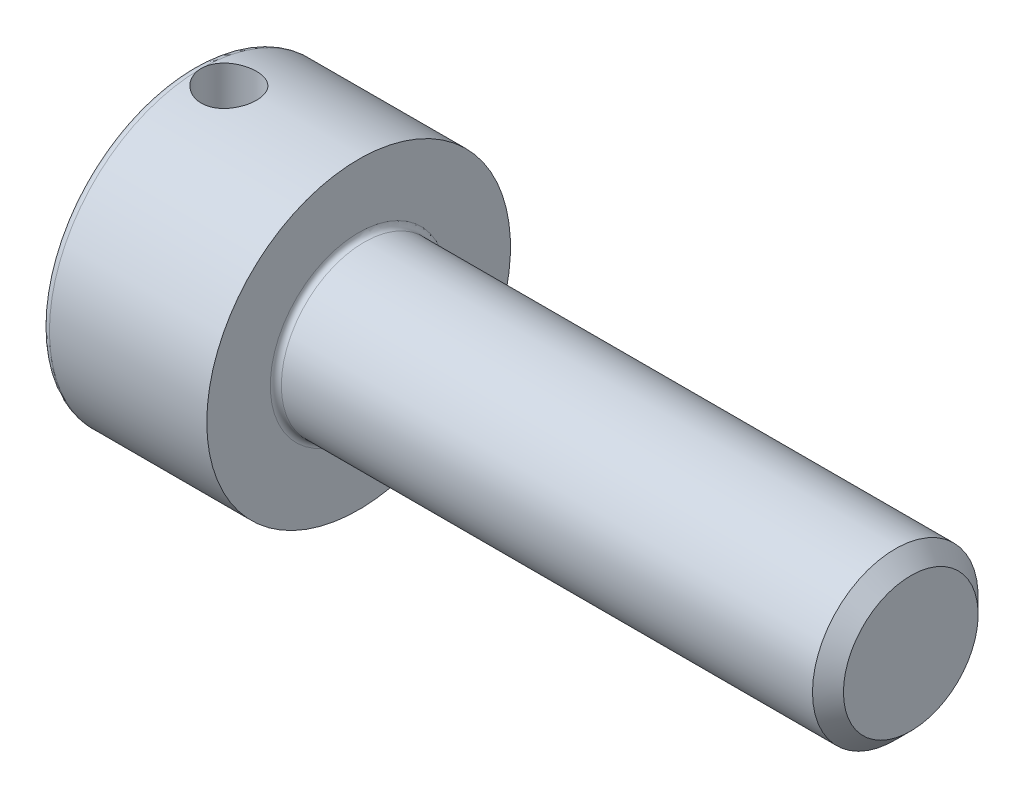
ISO-10303-21;
HEADER;
FILE_DESCRIPTION(('STEP AP214'),'2;1');
FILE_NAME('part.step','',(''),(''),'','','');
FILE_SCHEMA(('AUTOMOTIVE_DESIGN { 1 0 10303 214 1 1 1 1 }'));
ENDSEC;
DATA;
#1=APPLICATION_CONTEXT('core data for automotive mechanical design processes');
#2=APPLICATION_PROTOCOL_DEFINITION('international standard','automotive_design',2000,#1);
#3=PRODUCT_CONTEXT('',#1,'mechanical');
#4=PRODUCT('Part','Part','',(#3));
#5=PRODUCT_RELATED_PRODUCT_CATEGORY('part','',(#4));
#6=PRODUCT_DEFINITION_FORMATION('','',#4);
#7=PRODUCT_DEFINITION_CONTEXT('part definition',#1,'design');
#8=PRODUCT_DEFINITION('design','',#6,#7);
#9=PRODUCT_DEFINITION_SHAPE('','',#8);
#10=(LENGTH_UNIT() NAMED_UNIT(*) SI_UNIT(.MILLI.,.METRE.));
#11=(NAMED_UNIT(*) PLANE_ANGLE_UNIT() SI_UNIT($,.RADIAN.));
#12=(NAMED_UNIT(*) SI_UNIT($,.STERADIAN.) SOLID_ANGLE_UNIT());
#13=UNCERTAINTY_MEASURE_WITH_UNIT(LENGTH_MEASURE(1.E-05),#10,'distance_accuracy_value','');
#14=(GEOMETRIC_REPRESENTATION_CONTEXT(3) GLOBAL_UNCERTAINTY_ASSIGNED_CONTEXT((#13)) GLOBAL_UNIT_ASSIGNED_CONTEXT((#10,
#11,#12)) REPRESENTATION_CONTEXT('',''));
#15=CARTESIAN_POINT('',(0.,0.,0.));
#16=DIRECTION('',(0.,0.,1.));
#17=DIRECTION('',(1.,0.,0.));
#18=AXIS2_PLACEMENT_3D('',#15,#16,#17);
#19=CARTESIAN_POINT('',(0.,0.,0.));
#20=DIRECTION('',(-1.,0.,0.));
#21=DIRECTION('',(0.,0.,1.));
#22=AXIS2_PLACEMENT_3D('',#19,#20,#21);
#23=PLANE('',#22);
#24=DIRECTION('',(0.,-0.499999999999999,0.866025403784439));
#25=VECTOR('',#24,1.);
#26=CARTESIAN_POINT('',(0.,1.47801668912544,0.));
#27=LINE('',#26,#25);
#28=CARTESIAN_POINT('',(0.,1.47801668912544,0.));
#29=VERTEX_POINT('',#28);
#30=CARTESIAN_POINT('',(0.,0.73900834456272,1.28));
#31=VERTEX_POINT('',#30);
#32=EDGE_CURVE('E132',#29,#31,#27,.T.);
#33=ORIENTED_EDGE('',*,*,#32,.T.);
#34=DIRECTION('',(0.,1.,0.));
#35=VECTOR('',#34,1.);
#36=CARTESIAN_POINT('',(0.,-0.739008344562723,1.28));
#37=LINE('',#36,#35);
#38=CARTESIAN_POINT('',(0.,-0.739008344562723,1.28));
#39=VERTEX_POINT('',#38);
#40=EDGE_CURVE('E288',#39,#31,#37,.T.);
#41=ORIENTED_EDGE('',*,*,#40,.F.);
#42=DIRECTION('',(0.,-0.500000000000001,-0.866025403784438));
#43=VECTOR('',#42,1.);
#44=CARTESIAN_POINT('',(0.,-0.739008344562723,1.28));
#45=LINE('',#44,#43);
#46=CARTESIAN_POINT('',(0.,-1.47801668912545,0.));
#47=VERTEX_POINT('',#46);
#48=EDGE_CURVE('E285',#39,#47,#45,.T.);
#49=ORIENTED_EDGE('',*,*,#48,.T.);
#50=DIRECTION('',(0.,0.499999999999999,-0.866025403784439));
#51=VECTOR('',#50,1.);
#52=CARTESIAN_POINT('',(0.,-1.47801668912545,0.));
#53=LINE('',#52,#51);
#54=CARTESIAN_POINT('',(0.,-0.739008344562727,-1.28));
#55=VERTEX_POINT('',#54);
#56=EDGE_CURVE('E282',#47,#55,#53,.T.);
#57=ORIENTED_EDGE('',*,*,#56,.T.);
#58=DIRECTION('',(0.,-1.,0.));
#59=VECTOR('',#58,1.);
#60=CARTESIAN_POINT('',(0.,0.739008344562717,-1.28));
#61=LINE('',#60,#59);
#62=CARTESIAN_POINT('',(0.,0.739008344562717,-1.28));
#63=VERTEX_POINT('',#62);
#64=EDGE_CURVE('E280',#63,#55,#61,.T.);
#65=ORIENTED_EDGE('',*,*,#64,.F.);
#66=DIRECTION('',(0.,-0.500000000000001,-0.866025403784438));
#67=VECTOR('',#66,1.);
#68=CARTESIAN_POINT('',(0.,1.47801668912544,0.));
#69=LINE('',#68,#67);
#70=EDGE_CURVE('E276',#29,#63,#69,.T.);
#71=ORIENTED_EDGE('',*,*,#70,.F.);
#72=EDGE_LOOP('',(#33,#41,#49,#57,#65,#71));
#73=FACE_BOUND('',#72,.T.);
#74=CARTESIAN_POINT('',(0.,0.,0.));
#75=DIRECTION('',(-1.,0.,0.));
#76=DIRECTION('',(0.,0.,1.));
#77=AXIS2_PLACEMENT_3D('',#74,#75,#76);
#78=CIRCLE('',#77,2.6);
#79=CARTESIAN_POINT('',(0.,0.,2.6));
#80=VERTEX_POINT('',#79);
#81=EDGE_CURVE('E230',#80,#80,#78,.T.);
#82=ORIENTED_EDGE('',*,*,#81,.T.);
#83=EDGE_LOOP('',(#82));
#84=FACE_BOUND('',#83,.T.);
#85=ADVANCED_FACE('F35',(#73,#84),#23,.T.);
#86=CARTESIAN_POINT('',(-31.75,0.,0.));
#87=DIRECTION('',(-1.,0.,0.));
#88=DIRECTION('',(0.,0.,1.));
#89=AXIS2_PLACEMENT_3D('',#86,#87,#88);
#90=CYLINDRICAL_SURFACE('',#89,2.75);
#91=CARTESIAN_POINT('',(0.149999999999997,-2.75,0.));
#92=CARTESIAN_POINT('',(0.150001079665167,-2.74999950181964,-0.0278393179110932));
#93=CARTESIAN_POINT('',(0.15233293937066,-2.74957288183359,-0.0556928624795506));
#94=CARTESIAN_POINT('',(0.161593366506228,-2.74791211875499,-0.110616101712077));
#95=CARTESIAN_POINT('',(0.16852591214534,-2.74667727680635,-0.137685096816518));
#96=CARTESIAN_POINT('',(0.186769282417744,-2.74353830808766,-0.190236893128437));
#97=CARTESIAN_POINT('',(0.198076258047438,-2.7416347698298,-0.215721065982544));
#98=CARTESIAN_POINT('',(0.224736832797944,-2.73736667874575,-0.264428000846125));
#99=CARTESIAN_POINT('',(0.240090066297046,-2.7350021675783,-0.287650966919761));
#100=CARTESIAN_POINT('',(0.274591477410674,-2.73004358374958,-0.331441110128096));
#101=CARTESIAN_POINT('',(0.293776460495188,-2.7274474314927,-0.351979056508364));
#102=CARTESIAN_POINT('',(0.335317588522454,-2.72233373802952,-0.389563393352697));
#103=CARTESIAN_POINT('',(0.357673952922284,-2.71981620227815,-0.406609541987443));
#104=CARTESIAN_POINT('',(0.405128182364941,-2.71512460052441,-0.436846737541192));
#105=CARTESIAN_POINT('',(0.430245133807591,-2.71295321777524,-0.45000828316389));
#106=CARTESIAN_POINT('',(0.482379662580989,-2.70922895819225,-0.471913867374946));
#107=CARTESIAN_POINT('',(0.509397086006257,-2.70767603134186,-0.480658263208187));
#108=CARTESIAN_POINT('',(0.564253662339147,-2.70538538379177,-0.493387994278287));
#109=CARTESIAN_POINT('',(0.592080647927403,-2.70463896155586,-0.497424166063612));
#110=CARTESIAN_POINT('',(0.648026101828639,-2.70401957858077,-0.500780621841721));
#111=CARTESIAN_POINT('',(0.676144545379005,-2.70414654423513,-0.500101303241607));
#112=CARTESIAN_POINT('',(0.731507978533252,-2.70525166262295,-0.4940873360675));
#113=CARTESIAN_POINT('',(0.758759466973928,-2.70621928203566,-0.48881029424768));
#114=CARTESIAN_POINT('',(0.811983754591789,-2.70888015318477,-0.473841308350066));
#115=CARTESIAN_POINT('',(0.837956502337945,-2.71057343408079,-0.464149186857971));
#116=CARTESIAN_POINT('',(0.888055697694681,-2.71450595388179,-0.440568244473239));
#117=CARTESIAN_POINT('',(0.912170860666529,-2.71674822928588,-0.426655975928849));
#118=CARTESIAN_POINT('',(0.957746184236321,-2.72152405502929,-0.395046258435107));
#119=CARTESIAN_POINT('',(0.979206090661557,-2.72405763320867,-0.377348447558961));
#120=CARTESIAN_POINT('',(1.01919474911109,-2.72917660202136,-0.338358498545881));
#121=CARTESIAN_POINT('',(1.03767542210923,-2.73176220454117,-0.317017043164224));
#122=CARTESIAN_POINT('',(1.0708012833702,-2.73665937609272,-0.271511135173328));
#123=CARTESIAN_POINT('',(1.08544643740531,-2.7389709426789,-0.247346657374539));
#124=CARTESIAN_POINT('',(1.11049184744625,-2.74306384456335,-0.196831899624324));
#125=CARTESIAN_POINT('',(1.12088731717399,-2.74484458139806,-0.170479195098873));
#126=CARTESIAN_POINT('',(1.13709079812342,-2.74767051367721,-0.116362103615667));
#127=CARTESIAN_POINT('',(1.14289926714348,-2.74871578252274,-0.0885978578290162));
#128=CARTESIAN_POINT('',(1.14969744047978,-2.74994298344665,-0.0328596623946248));
#129=CARTESIAN_POINT('',(1.15075305586352,-2.75013672335286,-0.00489400302723347));
#130=CARTESIAN_POINT('',(1.14819205045462,-2.74967157561875,0.0508143097427419));
#131=CARTESIAN_POINT('',(1.14457564498206,-2.74901272727178,0.0785569733632705));
#132=CARTESIAN_POINT('',(1.13282806260953,-2.74692377158113,0.132824274398189));
#133=CARTESIAN_POINT('',(1.12473003270429,-2.7454993289304,0.159356324364579));
#134=CARTESIAN_POINT('',(1.10428479286951,-2.74203823780556,0.210686178439153));
#135=CARTESIAN_POINT('',(1.09193730807557,-2.74000154973109,0.235483870240237));
#136=CARTESIAN_POINT('',(1.06319634054927,-2.7355124489621,0.282923811768734));
#137=CARTESIAN_POINT('',(1.04676232821102,-2.7330559540365,0.30554111302122));
#138=CARTESIAN_POINT('',(1.01036990583222,-2.72801072017771,0.347720534555868));
#139=CARTESIAN_POINT('',(0.990411187647012,-2.72542196969626,0.36728238743583));
#140=CARTESIAN_POINT('',(0.947238279637873,-2.72036509889411,0.403044344719199));
#141=CARTESIAN_POINT('',(0.923986673368531,-2.71789888030471,0.419199591853546));
#142=CARTESIAN_POINT('',(0.875060954648376,-2.71340377520255,0.447374966380034));
#143=CARTESIAN_POINT('',(0.849386928828901,-2.71137487305885,0.459395241576988));
#144=CARTESIAN_POINT('',(0.796462312577061,-2.70799886153869,0.478894863104366));
#145=CARTESIAN_POINT('',(0.769219692315484,-2.70664859504187,0.4863952696546));
#146=CARTESIAN_POINT('',(0.71383425284223,-2.70477531636347,0.496707600446384));
#147=CARTESIAN_POINT('',(0.685691528787767,-2.7042522170284,0.499520018634073));
#148=CARTESIAN_POINT('',(0.629753656134088,-2.70409673470654,0.50036078415796));
#149=CARTESIAN_POINT('',(0.601959582140362,-2.70445118636029,0.498459842503081));
#150=CARTESIAN_POINT('',(0.547094090495644,-2.70598177186757,0.490082117282036));
#151=CARTESIAN_POINT('',(0.520022669126426,-2.70715790149252,0.483605357264294));
#152=CARTESIAN_POINT('',(0.467405950651155,-2.71019393020228,0.466288917896191));
#153=CARTESIAN_POINT('',(0.441858209944139,-2.71205269824937,0.455456452548081));
#154=CARTESIAN_POINT('',(0.392931388208813,-2.71624544378711,0.429743684162057));
#155=CARTESIAN_POINT('',(0.369552447788601,-2.71857945205735,0.414863118922517));
#156=CARTESIAN_POINT('',(0.325271781351091,-2.72350081162866,0.381228859156997));
#157=CARTESIAN_POINT('',(0.304409607532306,-2.72609126957776,0.362423538882748));
#158=CARTESIAN_POINT('',(0.266113229746949,-2.73120998017163,0.32158162855841));
#159=CARTESIAN_POINT('',(0.248679814901936,-2.73373821837979,0.299544296700233));
#160=CARTESIAN_POINT('',(0.217599925719125,-2.73847243574298,0.252642797411575));
#161=CARTESIAN_POINT('',(0.203986453704965,-2.74067553293358,0.227756462447624));
#162=CARTESIAN_POINT('',(0.181155195981484,-2.74448315248337,0.176018476271586));
#163=CARTESIAN_POINT('',(0.171933210180418,-2.74608824646183,0.149168731371668));
#164=CARTESIAN_POINT('',(0.160056142424449,-2.74818517594122,0.101860437364601));
#165=CARTESIAN_POINT('',(0.156291416759909,-2.74886195068396,0.0816813568191222));
#166=CARTESIAN_POINT('',(0.151262976551272,-2.74976954108261,0.0410040855330506));
#167=CARTESIAN_POINT('',(0.149999204739555,-2.75000036695,0.0205059021102082));
#168=CARTESIAN_POINT('',(0.149999999999997,-2.75,0.));
#169=B_SPLINE_CURVE_WITH_KNOTS('',3,(#91,#92,#93,#94,#95,#96,#97,#98,#99,#100,#101,#102,#103,
#104,#105,#106,#107,#108,#109,#110,#111,#112,#113,#114,#115,#116,#117,#118,#119,#120,#121,#122,
#123,#124,#125,#126,#127,#128,#129,#130,#131,#132,#133,#134,#135,#136,#137,#138,#139,#140,#141,
#142,#143,#144,#145,#146,#147,#148,#149,#150,#151,#152,#153,#154,#155,#156,#157,#158,#159,#160,
#161,#162,#163,#164,#165,#166,#167,#168),.UNSPECIFIED.,.T.,.F.,(4,2,2,2,2,2,2,2,2,2,2,2,2,2,2,2,
2,2,2,2,2,2,2,2,2,2,2,2,2,2,2,2,2,2,2,2,2,2,4),(0.,0.083442972888083,0.166958193018147,
0.250400095716686,0.333834461150375,0.418112536492213,0.502396446657696,0.587304880509126,
0.672206446139326,0.756182552931613,0.840151582560506,0.923083418227238,1.00601858669718,
1.08942326615406,1.17283592330314,1.25748302610468,1.34213088426162,1.42687381755953,
1.51160829215363,1.59516400249341,1.67871586212699,1.76165785821357,1.84460522018555,
1.92841056698916,2.01222324404031,2.09707876532615,2.18193125313119,2.26638525269039,
2.350830353259,2.43401627432593,2.51720176729828,2.6002500506474,2.68330371444226,
2.7675277863251,2.85177121957366,2.93672151135732,3.02159039124541,3.0830542755739,
3.14451675246691),.UNSPECIFIED.);
#170=CARTESIAN_POINT('',(0.149999999999997,-2.75,0.));
#171=VERTEX_POINT('',#170);
#172=EDGE_CURVE('E125',#171,#171,#169,.T.);
#173=ORIENTED_EDGE('',*,*,#172,.F.);
#174=CARTESIAN_POINT('',(0.149999999999997,0.,0.));
#175=DIRECTION('',(-1.,0.,0.));
#176=DIRECTION('',(0.,0.,1.));
#177=AXIS2_PLACEMENT_3D('',#174,#175,#176);
#178=CIRCLE('',#177,2.75);
#179=CARTESIAN_POINT('',(0.149999999999997,2.75,0.));
#180=VERTEX_POINT('',#179);
#181=EDGE_CURVE('E43',#171,#180,#178,.F.);
#182=ORIENTED_EDGE('',*,*,#181,.T.);
#183=CARTESIAN_POINT('',(0.149999999999997,2.75,0.));
#184=CARTESIAN_POINT('',(0.150001079665167,2.74999950181964,0.0278393179110932));
#185=CARTESIAN_POINT('',(0.15233293937066,2.74957288183359,0.0556928624795506));
#186=CARTESIAN_POINT('',(0.161593366506228,2.74791211875499,0.110616101712077));
#187=CARTESIAN_POINT('',(0.16852591214534,2.74667727680635,0.137685096816518));
#188=CARTESIAN_POINT('',(0.186769282417744,2.74353830808766,0.190236893128437));
#189=CARTESIAN_POINT('',(0.198076258047438,2.7416347698298,0.215721065982544));
#190=CARTESIAN_POINT('',(0.224736832797944,2.73736667874575,0.264428000846125));
#191=CARTESIAN_POINT('',(0.240090066297046,2.7350021675783,0.287650966919761));
#192=CARTESIAN_POINT('',(0.274591477410674,2.73004358374958,0.331441110128096));
#193=CARTESIAN_POINT('',(0.293776460495188,2.7274474314927,0.351979056508364));
#194=CARTESIAN_POINT('',(0.335317588522454,2.72233373802952,0.389563393352697));
#195=CARTESIAN_POINT('',(0.357673952922284,2.71981620227815,0.406609541987443));
#196=CARTESIAN_POINT('',(0.405128182364941,2.71512460052441,0.436846737541192));
#197=CARTESIAN_POINT('',(0.430245133807591,2.71295321777524,0.45000828316389));
#198=CARTESIAN_POINT('',(0.482379662580989,2.70922895819225,0.471913867374946));
#199=CARTESIAN_POINT('',(0.509397086006257,2.70767603134186,0.480658263208187));
#200=CARTESIAN_POINT('',(0.564253662339147,2.70538538379177,0.493387994278287));
#201=CARTESIAN_POINT('',(0.592080647927403,2.70463896155586,0.497424166063612));
#202=CARTESIAN_POINT('',(0.648026101828639,2.70401957858077,0.500780621841721));
#203=CARTESIAN_POINT('',(0.676144545379005,2.70414654423513,0.500101303241607));
#204=CARTESIAN_POINT('',(0.731507978533252,2.70525166262295,0.4940873360675));
#205=CARTESIAN_POINT('',(0.758759466973928,2.70621928203566,0.48881029424768));
#206=CARTESIAN_POINT('',(0.811983754591789,2.70888015318477,0.473841308350066));
#207=CARTESIAN_POINT('',(0.837956502337945,2.71057343408079,0.464149186857971));
#208=CARTESIAN_POINT('',(0.888055697694681,2.71450595388179,0.440568244473239));
#209=CARTESIAN_POINT('',(0.912170860666529,2.71674822928588,0.426655975928849));
#210=CARTESIAN_POINT('',(0.957746184236321,2.72152405502929,0.395046258435107));
#211=CARTESIAN_POINT('',(0.979206090661557,2.72405763320867,0.377348447558961));
#212=CARTESIAN_POINT('',(1.01919474911109,2.72917660202136,0.338358498545881));
#213=CARTESIAN_POINT('',(1.03767542210923,2.73176220454117,0.317017043164224));
#214=CARTESIAN_POINT('',(1.0708012833702,2.73665937609272,0.271511135173328));
#215=CARTESIAN_POINT('',(1.08544643740531,2.7389709426789,0.247346657374539));
#216=CARTESIAN_POINT('',(1.11049184744625,2.74306384456335,0.196831899624324));
#217=CARTESIAN_POINT('',(1.12088731717399,2.74484458139806,0.170479195098873));
#218=CARTESIAN_POINT('',(1.13709079812342,2.74767051367721,0.116362103615667));
#219=CARTESIAN_POINT('',(1.14289926714348,2.74871578252274,0.0885978578290162));
#220=CARTESIAN_POINT('',(1.14969744047978,2.74994298344665,0.0328596623946248));
#221=CARTESIAN_POINT('',(1.15075305586352,2.75013672335286,0.00489400302723347));
#222=CARTESIAN_POINT('',(1.14819205045462,2.74967157561875,-0.0508143097427419));
#223=CARTESIAN_POINT('',(1.14457564498206,2.74901272727178,-0.0785569733632705));
#224=CARTESIAN_POINT('',(1.13282806260953,2.74692377158113,-0.132824274398189));
#225=CARTESIAN_POINT('',(1.12473003270429,2.7454993289304,-0.159356324364579));
#226=CARTESIAN_POINT('',(1.10428479286951,2.74203823780556,-0.210686178439153));
#227=CARTESIAN_POINT('',(1.09193730807557,2.74000154973109,-0.235483870240237));
#228=CARTESIAN_POINT('',(1.06319634054927,2.7355124489621,-0.282923811768734));
#229=CARTESIAN_POINT('',(1.04676232821102,2.7330559540365,-0.30554111302122));
#230=CARTESIAN_POINT('',(1.01036990583222,2.72801072017771,-0.347720534555868));
#231=CARTESIAN_POINT('',(0.990411187647012,2.72542196969626,-0.36728238743583));
#232=CARTESIAN_POINT('',(0.947238279637873,2.72036509889411,-0.403044344719199));
#233=CARTESIAN_POINT('',(0.923986673368531,2.71789888030471,-0.419199591853546));
#234=CARTESIAN_POINT('',(0.875060954648376,2.71340377520255,-0.447374966380034));
#235=CARTESIAN_POINT('',(0.849386928828901,2.71137487305885,-0.459395241576988));
#236=CARTESIAN_POINT('',(0.796462312577061,2.70799886153869,-0.478894863104366));
#237=CARTESIAN_POINT('',(0.769219692315484,2.70664859504187,-0.4863952696546));
#238=CARTESIAN_POINT('',(0.71383425284223,2.70477531636347,-0.496707600446384));
#239=CARTESIAN_POINT('',(0.685691528787767,2.7042522170284,-0.499520018634073));
#240=CARTESIAN_POINT('',(0.629753656134088,2.70409673470654,-0.50036078415796));
#241=CARTESIAN_POINT('',(0.601959582140362,2.70445118636029,-0.498459842503081));
#242=CARTESIAN_POINT('',(0.547094090495644,2.70598177186757,-0.490082117282036));
#243=CARTESIAN_POINT('',(0.520022669126426,2.70715790149252,-0.483605357264294));
#244=CARTESIAN_POINT('',(0.467405950651155,2.71019393020228,-0.466288917896191));
#245=CARTESIAN_POINT('',(0.441858209944139,2.71205269824937,-0.455456452548081));
#246=CARTESIAN_POINT('',(0.392931388208813,2.71624544378711,-0.429743684162057));
#247=CARTESIAN_POINT('',(0.369552447788601,2.71857945205735,-0.414863118922517));
#248=CARTESIAN_POINT('',(0.325271781351091,2.72350081162866,-0.381228859156997));
#249=CARTESIAN_POINT('',(0.304409607532306,2.72609126957776,-0.362423538882748));
#250=CARTESIAN_POINT('',(0.266113229746949,2.73120998017163,-0.32158162855841));
#251=CARTESIAN_POINT('',(0.248679814901936,2.73373821837979,-0.299544296700233));
#252=CARTESIAN_POINT('',(0.217599925719125,2.73847243574298,-0.252642797411575));
#253=CARTESIAN_POINT('',(0.203986453704965,2.74067553293358,-0.227756462447624));
#254=CARTESIAN_POINT('',(0.181155195981484,2.74448315248337,-0.176018476271586));
#255=CARTESIAN_POINT('',(0.171933210180418,2.74608824646183,-0.149168731371668));
#256=CARTESIAN_POINT('',(0.160056142424449,2.74818517594122,-0.101860437364601));
#257=CARTESIAN_POINT('',(0.156291416759909,2.74886195068396,-0.0816813568191222));
#258=CARTESIAN_POINT('',(0.151262976551272,2.74976954108261,-0.0410040855330506));
#259=CARTESIAN_POINT('',(0.149999204739555,2.75000036695,-0.0205059021102082));
#260=CARTESIAN_POINT('',(0.149999999999997,2.75,0.));
#261=B_SPLINE_CURVE_WITH_KNOTS('',3,(#183,#184,#185,#186,#187,#188,#189,#190,#191,#192,#193,
#194,#195,#196,#197,#198,#199,#200,#201,#202,#203,#204,#205,#206,#207,#208,#209,#210,#211,#212,
#213,#214,#215,#216,#217,#218,#219,#220,#221,#222,#223,#224,#225,#226,#227,#228,#229,#230,#231,
#232,#233,#234,#235,#236,#237,#238,#239,#240,#241,#242,#243,#244,#245,#246,#247,#248,#249,#250,
#251,#252,#253,#254,#255,#256,#257,#258,#259,#260),.UNSPECIFIED.,.T.,.F.,(4,2,2,2,2,2,2,2,2,2,2,
2,2,2,2,2,2,2,2,2,2,2,2,2,2,2,2,2,2,2,2,2,2,2,2,2,2,2,4),(0.,0.083442972888083,
0.166958193018147,0.250400095716686,0.333834461150375,0.418112536492213,0.502396446657696,
0.587304880509126,0.672206446139326,0.756182552931613,0.840151582560506,0.923083418227238,
1.00601858669718,1.08942326615406,1.17283592330314,1.25748302610468,1.34213088426162,
1.42687381755953,1.51160829215363,1.59516400249341,1.67871586212699,1.76165785821357,
1.84460522018555,1.92841056698916,2.01222324404031,2.09707876532615,2.18193125313119,
2.26638525269039,2.350830353259,2.43401627432593,2.51720176729828,2.6002500506474,
2.68330371444226,2.7675277863251,2.85177121957366,2.93672151135732,3.02159039124541,
3.0830542755739,3.14451675246691),.UNSPECIFIED.);
#262=EDGE_CURVE('E130',#180,#180,#261,.T.);
#263=ORIENTED_EDGE('',*,*,#262,.F.);
#264=EDGE_CURVE('E238',#180,#171,#178,.F.);
#265=ORIENTED_EDGE('',*,*,#264,.T.);
#266=EDGE_LOOP('',(#173,#182,#263,#265));
#267=FACE_BOUND('',#266,.T.);
#268=CARTESIAN_POINT('',(3.,0.,0.));
#269=DIRECTION('',(-1.,0.,0.));
#270=DIRECTION('',(0.,0.,1.));
#271=AXIS2_PLACEMENT_3D('',#268,#269,#270);
#272=CIRCLE('',#271,2.75);
#273=CARTESIAN_POINT('',(3.,0.,2.75));
#274=VERTEX_POINT('',#273);
#275=EDGE_CURVE('E228',#274,#274,#272,.T.);
#276=ORIENTED_EDGE('',*,*,#275,.T.);
#277=EDGE_LOOP('',(#276));
#278=FACE_BOUND('',#277,.T.);
#279=ADVANCED_FACE('F146',(#267,#278),#90,.T.);
#280=CARTESIAN_POINT('',(3.,2.75,0.));
#281=DIRECTION('',(1.,0.,0.));
#282=DIRECTION('',(0.,0.,-1.));
#283=AXIS2_PLACEMENT_3D('',#280,#281,#282);
#284=PLANE('',#283);
#285=CARTESIAN_POINT('',(3.,0.,0.));
#286=DIRECTION('',(1.,0.,0.));
#287=DIRECTION('',(0.,0.,-1.));
#288=AXIS2_PLACEMENT_3D('',#285,#286,#287);
#289=CIRCLE('',#288,1.59999999999999);
#290=CARTESIAN_POINT('',(3.,0.,-1.59999999999999));
#291=VERTEX_POINT('',#290);
#292=EDGE_CURVE('E227',#291,#291,#289,.F.);
#293=ORIENTED_EDGE('',*,*,#292,.T.);
#294=EDGE_LOOP('',(#293));
#295=FACE_BOUND('',#294,.T.);
#296=ORIENTED_EDGE('',*,*,#275,.F.);
#297=EDGE_LOOP('',(#296));
#298=FACE_BOUND('',#297,.T.);
#299=ADVANCED_FACE('F201',(#295,#298),#284,.T.);
#300=CARTESIAN_POINT('',(-31.75,0.,0.));
#301=DIRECTION('',(-1.,0.,0.));
#302=DIRECTION('',(0.,0.,1.));
#303=AXIS2_PLACEMENT_3D('',#300,#301,#302);
#304=CYLINDRICAL_SURFACE('',#303,1.49999999999999);
#305=CARTESIAN_POINT('',(3.1,0.,0.));
#306=DIRECTION('',(1.,0.,0.));
#307=DIRECTION('',(0.,0.,-1.));
#308=AXIS2_PLACEMENT_3D('',#305,#306,#307);
#309=CIRCLE('',#308,1.49999999999999);
#310=CARTESIAN_POINT('',(3.1,0.,-1.49999999999999));
#311=VERTEX_POINT('',#310);
#312=EDGE_CURVE('E225',#311,#311,#309,.T.);
#313=ORIENTED_EDGE('',*,*,#312,.T.);
#314=EDGE_LOOP('',(#313));
#315=FACE_BOUND('',#314,.T.);
#316=CARTESIAN_POINT('',(12.7195,0.,0.));
#317=DIRECTION('',(-1.,0.,0.));
#318=DIRECTION('',(0.,0.,1.));
#319=AXIS2_PLACEMENT_3D('',#316,#317,#318);
#320=CIRCLE('',#319,1.49999999999998);
#321=CARTESIAN_POINT('',(12.7195,0.,1.49999999999998));
#322=VERTEX_POINT('',#321);
#323=EDGE_CURVE('E233',#322,#322,#320,.T.);
#324=ORIENTED_EDGE('',*,*,#323,.T.);
#325=EDGE_LOOP('',(#324));
#326=FACE_BOUND('',#325,.T.);
#327=ADVANCED_FACE('F198',(#315,#326),#304,.T.);
#328=CARTESIAN_POINT('',(13.,0.,0.));
#329=DIRECTION('',(-1.,0.,0.));
#330=DIRECTION('',(0.,0.,1.));
#331=AXIS2_PLACEMENT_3D('',#328,#329,#330);
#332=CONICAL_SURFACE('',#331,1.2195,0.785398163397391);
#333=ORIENTED_EDGE('',*,*,#323,.F.);
#334=EDGE_LOOP('',(#333));
#335=FACE_BOUND('',#334,.T.);
#336=CARTESIAN_POINT('',(13.,0.,0.));
#337=DIRECTION('',(-1.,0.,0.));
#338=DIRECTION('',(0.,0.,1.));
#339=AXIS2_PLACEMENT_3D('',#336,#337,#338);
#340=CIRCLE('',#339,1.2195);
#341=CARTESIAN_POINT('',(13.,0.,1.2195));
#342=VERTEX_POINT('',#341);
#343=EDGE_CURVE('E248',#342,#342,#340,.T.);
#344=ORIENTED_EDGE('',*,*,#343,.T.);
#345=EDGE_LOOP('',(#344));
#346=FACE_BOUND('',#345,.T.);
#347=ADVANCED_FACE('F194',(#335,#346),#332,.T.);
#348=CARTESIAN_POINT('',(13.,1.2195,0.));
#349=DIRECTION('',(1.,0.,0.));
#350=DIRECTION('',(0.,0.,-1.));
#351=AXIS2_PLACEMENT_3D('',#348,#349,#350);
#352=PLANE('',#351);
#353=ORIENTED_EDGE('',*,*,#343,.F.);
#354=EDGE_LOOP('',(#353));
#355=FACE_BOUND('',#354,.T.);
#356=ADVANCED_FACE('F190',(#355),#352,.T.);
#357=CARTESIAN_POINT('',(3.1,0.,0.));
#358=DIRECTION('',(1.,0.,0.));
#359=DIRECTION('',(0.,0.,-1.));
#360=AXIS2_PLACEMENT_3D('',#357,#358,#359);
#361=TOROIDAL_SURFACE('',#360,1.59999999999999,0.1);
#362=ORIENTED_EDGE('',*,*,#312,.F.);
#363=EDGE_LOOP('',(#362));
#364=FACE_BOUND('',#363,.T.);
#365=ORIENTED_EDGE('',*,*,#292,.F.);
#366=EDGE_LOOP('',(#365));
#367=FACE_BOUND('',#366,.T.);
#368=ADVANCED_FACE('F193',(#364,#367),#361,.F.);
#369=CARTESIAN_POINT('',(0.149999999999997,0.,0.));
#370=DIRECTION('',(-1.,0.,0.));
#371=DIRECTION('',(0.,0.,1.));
#372=AXIS2_PLACEMENT_3D('',#369,#370,#371);
#373=TOROIDAL_SURFACE('',#372,2.6,0.15);
#374=ORIENTED_EDGE('',*,*,#181,.F.);
#375=ORIENTED_EDGE('',*,*,#264,.F.);
#376=EDGE_LOOP('',(#374,#375));
#377=FACE_BOUND('',#376,.T.);
#378=ORIENTED_EDGE('',*,*,#81,.F.);
#379=EDGE_LOOP('',(#378));
#380=FACE_BOUND('',#379,.T.);
#381=ADVANCED_FACE('F37',(#377,#380),#373,.T.);
#382=CARTESIAN_POINT('',(1.3,1.47801668912544,0.));
#383=DIRECTION('',(0.,-0.866025403784439,-0.499999999999999));
#384=DIRECTION('',(0.,0.499999999999999,-0.866025403784439));
#385=AXIS2_PLACEMENT_3D('',#382,#383,#384);
#386=PLANE('',#385);
#387=CARTESIAN_POINT('',(0.649999999999997,1.47801668912544,0.));
#388=DIRECTION('',(0.,-0.866025403784439,-0.499999999999999));
#389=DIRECTION('',(0.,0.499999999999999,-0.866025403784439));
#390=AXIS2_PLACEMENT_3D('',#387,#388,#389);
#391=ELLIPSE('',#390,0.577350269189626,0.5);
#392=CARTESIAN_POINT('',(1.15,1.47801668912544,0.));
#393=VERTEX_POINT('',#392);
#394=CARTESIAN_POINT('',(0.149999999999997,1.47801668912544,0.));
#395=VERTEX_POINT('',#394);
#396=EDGE_CURVE('E56',#393,#395,#391,.T.);
#397=ORIENTED_EDGE('',*,*,#396,.F.);
#398=DIRECTION('',(-1.,0.,0.));
#399=VECTOR('',#398,1.);
#400=CARTESIAN_POINT('',(1.3,1.47801668912544,0.));
#401=LINE('',#400,#399);
#402=CARTESIAN_POINT('',(1.3,1.47801668912544,0.));
#403=VERTEX_POINT('',#402);
#404=EDGE_CURVE('E272',#403,#393,#401,.T.);
#405=ORIENTED_EDGE('',*,*,#404,.F.);
#406=DIRECTION('',(0.,-0.499999999999999,0.866025403784439));
#407=VECTOR('',#406,1.);
#408=CARTESIAN_POINT('',(1.3,1.47801668912544,0.));
#409=LINE('',#408,#407);
#410=CARTESIAN_POINT('',(1.3,1.10851251684408,0.639999999999997));
#411=VERTEX_POINT('',#410);
#412=EDGE_CURVE('E309',#403,#411,#409,.T.);
#413=ORIENTED_EDGE('',*,*,#412,.T.);
#414=CARTESIAN_POINT('',(1.3,0.73900834456272,1.28));
#415=VERTEX_POINT('',#414);
#416=EDGE_CURVE('E279',#411,#415,#409,.T.);
#417=ORIENTED_EDGE('',*,*,#416,.T.);
#418=DIRECTION('',(-1.,0.,0.));
#419=VECTOR('',#418,1.);
#420=CARTESIAN_POINT('',(1.3,0.73900834456272,1.28));
#421=LINE('',#420,#419);
#422=EDGE_CURVE('E256',#415,#31,#421,.T.);
#423=ORIENTED_EDGE('',*,*,#422,.T.);
#424=ORIENTED_EDGE('',*,*,#32,.F.);
#425=EDGE_CURVE('E275',#395,#29,#401,.T.);
#426=ORIENTED_EDGE('',*,*,#425,.F.);
#427=EDGE_LOOP('',(#397,#405,#413,#417,#423,#424,#426));
#428=FACE_BOUND('',#427,.T.);
#429=ADVANCED_FACE('F182',(#428),#386,.T.);
#430=CARTESIAN_POINT('',(1.3,-0.739008344562723,1.28));
#431=DIRECTION('',(0.,0.,1.));
#432=DIRECTION('',(0.,-1.,0.));
#433=AXIS2_PLACEMENT_3D('',#430,#431,#432);
#434=PLANE('',#433);
#435=ORIENTED_EDGE('',*,*,#40,.T.);
#436=ORIENTED_EDGE('',*,*,#422,.F.);
#437=DIRECTION('',(0.,1.,0.));
#438=VECTOR('',#437,1.);
#439=CARTESIAN_POINT('',(1.3,-0.739008344562723,1.28));
#440=LINE('',#439,#438);
#441=CARTESIAN_POINT('',(1.3,0.,1.28));
#442=VERTEX_POINT('',#441);
#443=EDGE_CURVE('E308',#442,#415,#440,.T.);
#444=ORIENTED_EDGE('',*,*,#443,.F.);
#445=CARTESIAN_POINT('',(1.3,-0.739008344562723,1.28));
#446=VERTEX_POINT('',#445);
#447=EDGE_CURVE('E306',#446,#442,#440,.T.);
#448=ORIENTED_EDGE('',*,*,#447,.F.);
#449=DIRECTION('',(-1.,0.,0.));
#450=VECTOR('',#449,1.);
#451=CARTESIAN_POINT('',(1.3,-0.739008344562723,1.28));
#452=LINE('',#451,#450);
#453=EDGE_CURVE('E259',#446,#39,#452,.T.);
#454=ORIENTED_EDGE('',*,*,#453,.T.);
#455=EDGE_LOOP('',(#435,#436,#444,#448,#454));
#456=FACE_BOUND('',#455,.T.);
#457=ADVANCED_FACE('F178',(#456),#434,.F.);
#458=CARTESIAN_POINT('',(1.3,-0.739008344562723,1.28));
#459=DIRECTION('',(0.,0.866025403784438,-0.500000000000001));
#460=DIRECTION('',(0.,0.500000000000001,0.866025403784438));
#461=AXIS2_PLACEMENT_3D('',#458,#459,#460);
#462=PLANE('',#461);
#463=CARTESIAN_POINT('',(0.649999999999997,-1.47801668912545,0.));
#464=DIRECTION('',(0.,0.866025403784438,-0.500000000000001));
#465=DIRECTION('',(0.,0.500000000000001,0.866025403784438));
#466=AXIS2_PLACEMENT_3D('',#463,#464,#465);
#467=ELLIPSE('',#466,0.577350269189626,0.5);
#468=CARTESIAN_POINT('',(0.149999999999997,-1.47801668912545,0.));
#469=VERTEX_POINT('',#468);
#470=CARTESIAN_POINT('',(1.15,-1.47801668912545,0.));
#471=VERTEX_POINT('',#470);
#472=EDGE_CURVE('E49',#469,#471,#467,.T.);
#473=ORIENTED_EDGE('',*,*,#472,.F.);
#474=DIRECTION('',(-1.,0.,0.));
#475=VECTOR('',#474,1.);
#476=CARTESIAN_POINT('',(1.3,-1.47801668912545,0.));
#477=LINE('',#476,#475);
#478=EDGE_CURVE('E265',#469,#47,#477,.T.);
#479=ORIENTED_EDGE('',*,*,#478,.T.);
#480=ORIENTED_EDGE('',*,*,#48,.F.);
#481=ORIENTED_EDGE('',*,*,#453,.F.);
#482=DIRECTION('',(0.,-0.500000000000001,-0.866025403784438));
#483=VECTOR('',#482,1.);
#484=CARTESIAN_POINT('',(1.3,-0.739008344562723,1.28));
#485=LINE('',#484,#483);
#486=CARTESIAN_POINT('',(1.3,-1.10851251684408,0.640000000000002));
#487=VERTEX_POINT('',#486);
#488=EDGE_CURVE('E302',#446,#487,#485,.T.);
#489=ORIENTED_EDGE('',*,*,#488,.T.);
#490=CARTESIAN_POINT('',(1.3,-1.47801668912545,0.));
#491=VERTEX_POINT('',#490);
#492=EDGE_CURVE('E305',#487,#491,#485,.T.);
#493=ORIENTED_EDGE('',*,*,#492,.T.);
#494=EDGE_CURVE('E262',#491,#471,#477,.T.);
#495=ORIENTED_EDGE('',*,*,#494,.T.);
#496=EDGE_LOOP('',(#473,#479,#480,#481,#489,#493,#495));
#497=FACE_BOUND('',#496,.T.);
#498=ADVANCED_FACE('F174',(#497),#462,.T.);
#499=CARTESIAN_POINT('',(1.3,-1.47801668912545,0.));
#500=DIRECTION('',(0.,0.866025403784439,0.499999999999999));
#501=DIRECTION('',(0.,-0.499999999999999,0.866025403784439));
#502=AXIS2_PLACEMENT_3D('',#499,#500,#501);
#503=PLANE('',#502);
#504=CARTESIAN_POINT('',(0.649999999999997,-1.47801668912545,0.));
#505=DIRECTION('',(0.,0.866025403784439,0.499999999999999));
#506=DIRECTION('',(0.,0.499999999999999,-0.866025403784439));
#507=AXIS2_PLACEMENT_3D('',#504,#505,#506);
#508=ELLIPSE('',#507,0.577350269189626,0.5);
#509=EDGE_CURVE('E134',#471,#469,#508,.T.);
#510=ORIENTED_EDGE('',*,*,#509,.F.);
#511=ORIENTED_EDGE('',*,*,#494,.F.);
#512=DIRECTION('',(0.,0.499999999999999,-0.866025403784439));
#513=VECTOR('',#512,1.);
#514=CARTESIAN_POINT('',(1.3,-1.47801668912545,0.));
#515=LINE('',#514,#513);
#516=CARTESIAN_POINT('',(1.3,-1.10851251684409,-0.640000000000001));
#517=VERTEX_POINT('',#516);
#518=EDGE_CURVE('E298',#491,#517,#515,.T.);
#519=ORIENTED_EDGE('',*,*,#518,.T.);
#520=CARTESIAN_POINT('',(1.3,-0.739008344562727,-1.28));
#521=VERTEX_POINT('',#520);
#522=EDGE_CURVE('E301',#517,#521,#515,.T.);
#523=ORIENTED_EDGE('',*,*,#522,.T.);
#524=DIRECTION('',(-1.,0.,0.));
#525=VECTOR('',#524,1.);
#526=CARTESIAN_POINT('',(1.3,-0.739008344562727,-1.28));
#527=LINE('',#526,#525);
#528=EDGE_CURVE('E266',#521,#55,#527,.T.);
#529=ORIENTED_EDGE('',*,*,#528,.T.);
#530=ORIENTED_EDGE('',*,*,#56,.F.);
#531=ORIENTED_EDGE('',*,*,#478,.F.);
#532=EDGE_LOOP('',(#510,#511,#519,#523,#529,#530,#531));
#533=FACE_BOUND('',#532,.T.);
#534=ADVANCED_FACE('F170',(#533),#503,.T.);
#535=CARTESIAN_POINT('',(1.3,0.739008344562717,-1.28));
#536=DIRECTION('',(0.,0.,-1.));
#537=DIRECTION('',(0.,1.,0.));
#538=AXIS2_PLACEMENT_3D('',#535,#536,#537);
#539=PLANE('',#538);
#540=ORIENTED_EDGE('',*,*,#64,.T.);
#541=ORIENTED_EDGE('',*,*,#528,.F.);
#542=DIRECTION('',(0.,-1.,0.));
#543=VECTOR('',#542,1.);
#544=CARTESIAN_POINT('',(1.3,0.739008344562717,-1.28));
#545=LINE('',#544,#543);
#546=CARTESIAN_POINT('',(1.3,0.,-1.28));
#547=VERTEX_POINT('',#546);
#548=EDGE_CURVE('E297',#547,#521,#545,.T.);
#549=ORIENTED_EDGE('',*,*,#548,.F.);
#550=CARTESIAN_POINT('',(1.3,0.739008344562717,-1.28));
#551=VERTEX_POINT('',#550);
#552=EDGE_CURVE('E295',#551,#547,#545,.T.);
#553=ORIENTED_EDGE('',*,*,#552,.F.);
#554=DIRECTION('',(-1.,0.,0.));
#555=VECTOR('',#554,1.);
#556=CARTESIAN_POINT('',(1.3,0.739008344562717,-1.28));
#557=LINE('',#556,#555);
#558=EDGE_CURVE('E269',#551,#63,#557,.T.);
#559=ORIENTED_EDGE('',*,*,#558,.T.);
#560=EDGE_LOOP('',(#540,#541,#549,#553,#559));
#561=FACE_BOUND('',#560,.T.);
#562=ADVANCED_FACE('F166',(#561),#539,.F.);
#563=CARTESIAN_POINT('',(1.3,1.47801668912544,0.));
#564=DIRECTION('',(0.,0.866025403784438,-0.500000000000001));
#565=DIRECTION('',(0.,0.500000000000001,0.866025403784438));
#566=AXIS2_PLACEMENT_3D('',#563,#564,#565);
#567=PLANE('',#566);
#568=ORIENTED_EDGE('',*,*,#404,.T.);
#569=CARTESIAN_POINT('',(0.649999999999997,1.47801668912544,0.));
#570=DIRECTION('',(0.,0.866025403784438,-0.500000000000001));
#571=DIRECTION('',(0.,0.500000000000001,0.866025403784438));
#572=AXIS2_PLACEMENT_3D('',#569,#570,#571);
#573=ELLIPSE('',#572,0.577350269189626,0.5);
#574=EDGE_CURVE('E11',#393,#395,#573,.T.);
#575=ORIENTED_EDGE('',*,*,#574,.T.);
#576=ORIENTED_EDGE('',*,*,#425,.T.);
#577=ORIENTED_EDGE('',*,*,#70,.T.);
#578=ORIENTED_EDGE('',*,*,#558,.F.);
#579=DIRECTION('',(0.,-0.500000000000001,-0.866025403784438));
#580=VECTOR('',#579,1.);
#581=CARTESIAN_POINT('',(1.3,1.47801668912544,0.));
#582=LINE('',#581,#580);
#583=CARTESIAN_POINT('',(1.3,1.10851251684408,-0.640000000000001));
#584=VERTEX_POINT('',#583);
#585=EDGE_CURVE('E294',#584,#551,#582,.T.);
#586=ORIENTED_EDGE('',*,*,#585,.F.);
#587=EDGE_CURVE('E291',#403,#584,#582,.T.);
#588=ORIENTED_EDGE('',*,*,#587,.F.);
#589=EDGE_LOOP('',(#568,#575,#576,#577,#578,#586,#588));
#590=FACE_BOUND('',#589,.T.);
#591=ADVANCED_FACE('F161',(#590),#567,.F.);
#592=CARTESIAN_POINT('',(1.3,1.47801668912544,0.));
#593=DIRECTION('',(1.,0.,0.));
#594=DIRECTION('',(0.,0.,-1.));
#595=AXIS2_PLACEMENT_3D('',#592,#593,#594);
#596=PLANE('',#595);
#597=ORIENTED_EDGE('',*,*,#548,.T.);
#598=ORIENTED_EDGE('',*,*,#522,.F.);
#599=CARTESIAN_POINT('',(1.3,0.,0.));
#600=DIRECTION('',(-1.,0.,0.));
#601=DIRECTION('',(0.,0.,1.));
#602=AXIS2_PLACEMENT_3D('',#599,#600,#601);
#603=CIRCLE('',#602,1.28);
#604=EDGE_CURVE('E331',#547,#517,#603,.T.);
#605=ORIENTED_EDGE('',*,*,#604,.F.);
#606=EDGE_LOOP('',(#597,#598,#605));
#607=FACE_BOUND('',#606,.T.);
#608=ADVANCED_FACE('F156',(#607),#596,.F.);
#609=ORIENTED_EDGE('',*,*,#518,.F.);
#610=ORIENTED_EDGE('',*,*,#492,.F.);
#611=EDGE_CURVE('E333',#517,#487,#603,.T.);
#612=ORIENTED_EDGE('',*,*,#611,.F.);
#613=EDGE_LOOP('',(#609,#610,#612));
#614=FACE_BOUND('',#613,.T.);
#615=ADVANCED_FACE('F160',(#614),#596,.F.);
#616=ORIENTED_EDGE('',*,*,#488,.F.);
#617=ORIENTED_EDGE('',*,*,#447,.T.);
#618=EDGE_CURVE('E255',#487,#442,#603,.T.);
#619=ORIENTED_EDGE('',*,*,#618,.F.);
#620=EDGE_LOOP('',(#616,#617,#619));
#621=FACE_BOUND('',#620,.T.);
#622=ADVANCED_FACE('F340',(#621),#596,.F.);
#623=ORIENTED_EDGE('',*,*,#443,.T.);
#624=ORIENTED_EDGE('',*,*,#416,.F.);
#625=EDGE_CURVE('E251',#442,#411,#603,.T.);
#626=ORIENTED_EDGE('',*,*,#625,.F.);
#627=EDGE_LOOP('',(#623,#624,#626));
#628=FACE_BOUND('',#627,.T.);
#629=ADVANCED_FACE('F377',(#628),#596,.F.);
#630=ORIENTED_EDGE('',*,*,#412,.F.);
#631=ORIENTED_EDGE('',*,*,#587,.T.);
#632=EDGE_CURVE('E254',#411,#584,#603,.T.);
#633=ORIENTED_EDGE('',*,*,#632,.F.);
#634=EDGE_LOOP('',(#630,#631,#633));
#635=FACE_BOUND('',#634,.T.);
#636=ADVANCED_FACE('F326',(#635),#596,.F.);
#637=ORIENTED_EDGE('',*,*,#585,.T.);
#638=ORIENTED_EDGE('',*,*,#552,.T.);
#639=EDGE_CURVE('E330',#584,#547,#603,.T.);
#640=ORIENTED_EDGE('',*,*,#639,.F.);
#641=EDGE_LOOP('',(#637,#638,#640));
#642=FACE_BOUND('',#641,.T.);
#643=ADVANCED_FACE('F163',(#642),#596,.F.);
#644=CARTESIAN_POINT('',(1.3,0.,0.));
#645=DIRECTION('',(-1.,0.,0.));
#646=DIRECTION('',(0.,0.,1.));
#647=AXIS2_PLACEMENT_3D('',#644,#645,#646);
#648=CONICAL_SURFACE('',#647,1.28,1.04719755119659);
#649=CARTESIAN_POINT('',(2.03900834456273,0.,0.));
#650=VERTEX_POINT('',#649);
#651=VERTEX_LOOP('',#650);
#652=FACE_BOUND('',#651,.T.);
#653=ORIENTED_EDGE('',*,*,#625,.T.);
#654=ORIENTED_EDGE('',*,*,#632,.T.);
#655=ORIENTED_EDGE('',*,*,#639,.T.);
#656=ORIENTED_EDGE('',*,*,#604,.T.);
#657=ORIENTED_EDGE('',*,*,#611,.T.);
#658=ORIENTED_EDGE('',*,*,#618,.T.);
#659=EDGE_LOOP('',(#653,#654,#655,#656,#657,#658));
#660=FACE_BOUND('',#659,.T.);
#661=ADVANCED_FACE('F154',(#652,#660),#648,.F.);
#662=CARTESIAN_POINT('',(0.649999999999997,-2.75,0.));
#663=DIRECTION('',(0.,1.,0.));
#664=DIRECTION('',(0.,0.,1.));
#665=AXIS2_PLACEMENT_3D('',#662,#663,#664);
#666=CYLINDRICAL_SURFACE('',#665,0.5);
#667=ORIENTED_EDGE('',*,*,#262,.T.);
#668=EDGE_LOOP('',(#667));
#669=FACE_BOUND('',#668,.T.);
#670=ORIENTED_EDGE('',*,*,#396,.T.);
#671=ORIENTED_EDGE('',*,*,#574,.F.);
#672=EDGE_LOOP('',(#670,#671));
#673=FACE_BOUND('',#672,.T.);
#674=ADVANCED_FACE('F150',(#669,#673),#666,.F.);
#675=ORIENTED_EDGE('',*,*,#172,.T.);
#676=EDGE_LOOP('',(#675));
#677=FACE_BOUND('',#676,.T.);
#678=ORIENTED_EDGE('',*,*,#472,.T.);
#679=ORIENTED_EDGE('',*,*,#509,.T.);
#680=EDGE_LOOP('',(#678,#679));
#681=FACE_BOUND('',#680,.T.);
#682=ADVANCED_FACE('F126',(#677,#681),#666,.F.);
#683=CLOSED_SHELL('',(#85,#279,#299,#327,#347,#356,#368,#381,#429,#457,#498,#534,#562,#591,#608,
#615,#622,#629,#636,#643,#661,#674,#682));
#684=MANIFOLD_SOLID_BREP('B2',#683);
#685=ADVANCED_BREP_SHAPE_REPRESENTATION('',(#18,#684),#14);
#686=SHAPE_DEFINITION_REPRESENTATION(#9,#685);
ENDSEC;
END-ISO-10303-21;
